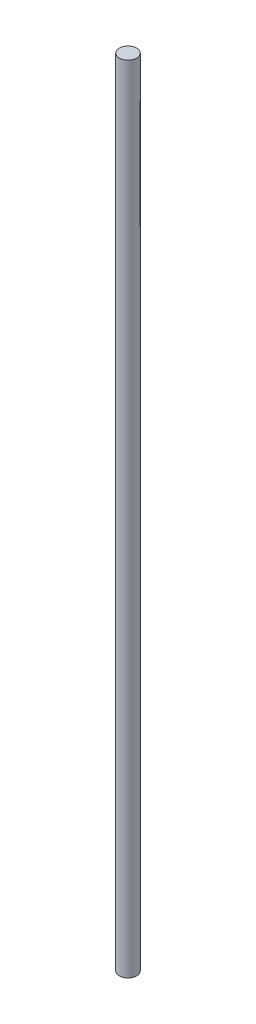
ISO-10303-21;
HEADER;
FILE_DESCRIPTION(('STEP AP214'),'2;1');
FILE_NAME('part.step','',(''),(''),'','','');
FILE_SCHEMA(('AUTOMOTIVE_DESIGN { 1 0 10303 214 1 1 1 1 }'));
ENDSEC;
DATA;
#1=APPLICATION_CONTEXT('core data for automotive mechanical design processes');
#2=APPLICATION_PROTOCOL_DEFINITION('international standard','automotive_design',2000,#1);
#3=PRODUCT_CONTEXT('',#1,'mechanical');
#4=PRODUCT('Part','Part','',(#3));
#5=PRODUCT_RELATED_PRODUCT_CATEGORY('part','',(#4));
#6=PRODUCT_DEFINITION_FORMATION('','',#4);
#7=PRODUCT_DEFINITION_CONTEXT('part definition',#1,'design');
#8=PRODUCT_DEFINITION('design','',#6,#7);
#9=PRODUCT_DEFINITION_SHAPE('','',#8);
#10=(LENGTH_UNIT() NAMED_UNIT(*) SI_UNIT(.MILLI.,.METRE.));
#11=(NAMED_UNIT(*) PLANE_ANGLE_UNIT() SI_UNIT($,.RADIAN.));
#12=(NAMED_UNIT(*) SI_UNIT($,.STERADIAN.) SOLID_ANGLE_UNIT());
#13=UNCERTAINTY_MEASURE_WITH_UNIT(LENGTH_MEASURE(1.E-05),#10,'distance_accuracy_value','');
#14=(GEOMETRIC_REPRESENTATION_CONTEXT(3) GLOBAL_UNCERTAINTY_ASSIGNED_CONTEXT((#13)) GLOBAL_UNIT_ASSIGNED_CONTEXT((#10,
#11,#12)) REPRESENTATION_CONTEXT('',''));
#15=CARTESIAN_POINT('',(0.,0.,0.));
#16=DIRECTION('',(0.,0.,1.));
#17=DIRECTION('',(1.,0.,0.));
#18=AXIS2_PLACEMENT_3D('',#15,#16,#17);
#19=CARTESIAN_POINT('',(0.,6875.,0.));
#20=DIRECTION('',(0.,-1.,0.));
#21=DIRECTION('',(0.,0.,-1.));
#22=AXIS2_PLACEMENT_3D('',#19,#20,#21);
#23=CYLINDRICAL_SURFACE('',#22,75.);
#24=CARTESIAN_POINT('',(0.,6875.,0.));
#25=DIRECTION('',(0.,1.,0.));
#26=DIRECTION('',(0.,0.,1.));
#27=AXIS2_PLACEMENT_3D('',#24,#25,#26);
#28=CIRCLE('',#27,75.);
#29=CARTESIAN_POINT('',(0.,6875.,75.));
#30=VERTEX_POINT('',#29);
#31=EDGE_CURVE('E10',#30,#30,#28,.T.);
#32=ORIENTED_EDGE('',*,*,#31,.F.);
#33=EDGE_LOOP('',(#32));
#34=FACE_BOUND('',#33,.T.);
#35=CARTESIAN_POINT('',(0.,0.,0.));
#36=DIRECTION('',(0.,1.,0.));
#37=DIRECTION('',(0.,0.,1.));
#38=AXIS2_PLACEMENT_3D('',#35,#36,#37);
#39=CIRCLE('',#38,75.);
#40=CARTESIAN_POINT('',(0.,0.,75.));
#41=VERTEX_POINT('',#40);
#42=EDGE_CURVE('E46',#41,#41,#39,.T.);
#43=ORIENTED_EDGE('',*,*,#42,.T.);
#44=EDGE_LOOP('',(#43));
#45=FACE_BOUND('',#44,.T.);
#46=ADVANCED_FACE('F43',(#34,#45),#23,.T.);
#47=CARTESIAN_POINT('',(0.,6875.,0.));
#48=DIRECTION('',(0.,1.,0.));
#49=DIRECTION('',(0.,0.,1.));
#50=AXIS2_PLACEMENT_3D('',#47,#48,#49);
#51=PLANE('',#50);
#52=ORIENTED_EDGE('',*,*,#31,.T.);
#53=EDGE_LOOP('',(#52));
#54=FACE_BOUND('',#53,.T.);
#55=ADVANCED_FACE('F60',(#54),#51,.T.);
#56=CARTESIAN_POINT('',(0.,0.,0.));
#57=DIRECTION('',(0.,1.,0.));
#58=DIRECTION('',(0.,0.,1.));
#59=AXIS2_PLACEMENT_3D('',#56,#57,#58);
#60=PLANE('',#59);
#61=ORIENTED_EDGE('',*,*,#42,.F.);
#62=EDGE_LOOP('',(#61));
#63=FACE_BOUND('',#62,.T.);
#64=ADVANCED_FACE('F58',(#63),#60,.F.);
#65=CLOSED_SHELL('',(#46,#55,#64));
#66=MANIFOLD_SOLID_BREP('B2',#65);
#67=ADVANCED_BREP_SHAPE_REPRESENTATION('',(#18,#66),#14);
#68=SHAPE_DEFINITION_REPRESENTATION(#9,#67);
ENDSEC;
END-ISO-10303-21;
